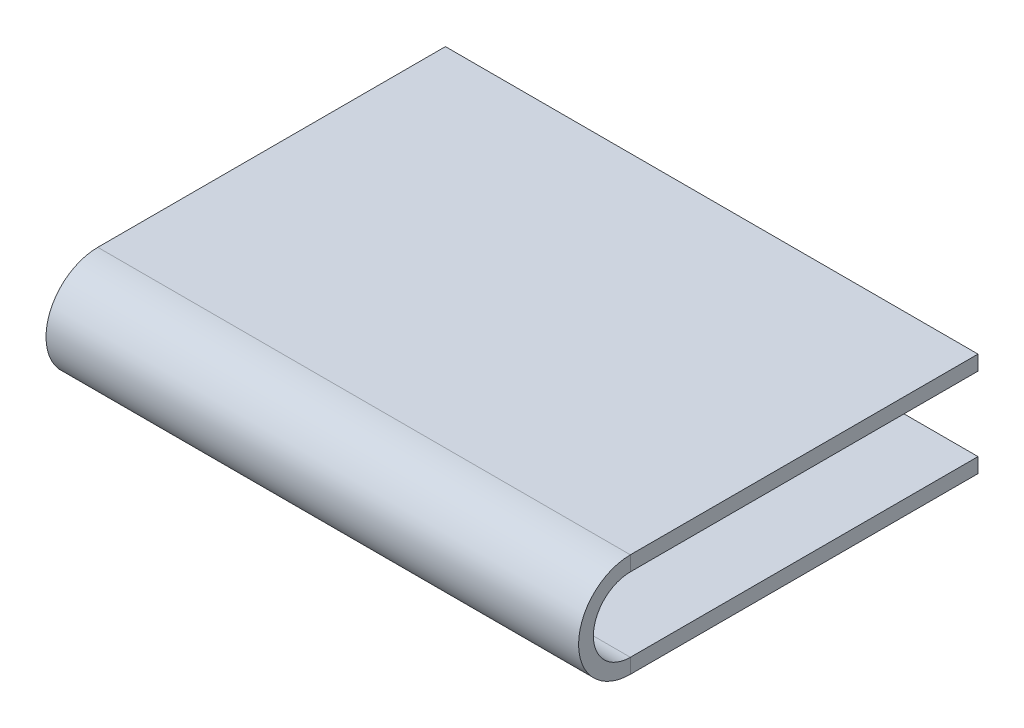
ISO-10303-21;
HEADER;
FILE_DESCRIPTION(('STEP AP214'),'2;1');
FILE_NAME('part.step','',(''),(''),'','','');
FILE_SCHEMA(('AUTOMOTIVE_DESIGN { 1 0 10303 214 1 1 1 1 }'));
ENDSEC;
DATA;
#1=APPLICATION_CONTEXT('core data for automotive mechanical design processes');
#2=APPLICATION_PROTOCOL_DEFINITION('international standard','automotive_design',2000,#1);
#3=PRODUCT_CONTEXT('',#1,'mechanical');
#4=PRODUCT('Part','Part','',(#3));
#5=PRODUCT_RELATED_PRODUCT_CATEGORY('part','',(#4));
#6=PRODUCT_DEFINITION_FORMATION('','',#4);
#7=PRODUCT_DEFINITION_CONTEXT('part definition',#1,'design');
#8=PRODUCT_DEFINITION('design','',#6,#7);
#9=PRODUCT_DEFINITION_SHAPE('','',#8);
#10=(LENGTH_UNIT() NAMED_UNIT(*) SI_UNIT(.MILLI.,.METRE.));
#11=(NAMED_UNIT(*) PLANE_ANGLE_UNIT() SI_UNIT($,.RADIAN.));
#12=(NAMED_UNIT(*) SI_UNIT($,.STERADIAN.) SOLID_ANGLE_UNIT());
#13=UNCERTAINTY_MEASURE_WITH_UNIT(LENGTH_MEASURE(1.E-05),#10,'distance_accuracy_value','');
#14=(GEOMETRIC_REPRESENTATION_CONTEXT(3) GLOBAL_UNCERTAINTY_ASSIGNED_CONTEXT((#13)) GLOBAL_UNIT_ASSIGNED_CONTEXT((#10,
#11,#12)) REPRESENTATION_CONTEXT('',''));
#15=CARTESIAN_POINT('',(0.,0.,0.));
#16=DIRECTION('',(0.,0.,1.));
#17=DIRECTION('',(1.,0.,0.));
#18=AXIS2_PLACEMENT_3D('',#15,#16,#17);
#19=CARTESIAN_POINT('',(36.,0.,23.5));
#20=DIRECTION('',(1.,0.,0.));
#21=DIRECTION('',(0.,0.,-1.));
#22=AXIS2_PLACEMENT_3D('',#19,#20,#21);
#23=PLANE('',#22);
#24=DIRECTION('',(0.,-1.,0.));
#25=VECTOR('',#24,1.);
#26=CARTESIAN_POINT('',(36.,0.,23.5));
#27=LINE('',#26,#25);
#28=CARTESIAN_POINT('',(36.,0.,23.5));
#29=VERTEX_POINT('',#28);
#30=CARTESIAN_POINT('',(36.,-0.999999999999999,23.5));
#31=VERTEX_POINT('',#30);
#32=EDGE_CURVE('E11',#29,#31,#27,.T.);
#33=ORIENTED_EDGE('',*,*,#32,.F.);
#34=CARTESIAN_POINT('',(36.,2.5,23.5));
#35=DIRECTION('',(1.,0.,0.));
#36=DIRECTION('',(0.,0.,-1.));
#37=AXIS2_PLACEMENT_3D('',#34,#35,#36);
#38=CIRCLE('',#37,2.5);
#39=CARTESIAN_POINT('',(36.,4.99999999999999,23.5));
#40=VERTEX_POINT('',#39);
#41=EDGE_CURVE('E136',#40,#29,#38,.T.);
#42=ORIENTED_EDGE('',*,*,#41,.F.);
#43=DIRECTION('',(0.,-1.,0.));
#44=VECTOR('',#43,1.);
#45=CARTESIAN_POINT('',(36.,5.99999999999999,23.5));
#46=LINE('',#45,#44);
#47=CARTESIAN_POINT('',(36.,5.99999999999999,23.5));
#48=VERTEX_POINT('',#47);
#49=EDGE_CURVE('E51',#48,#40,#46,.T.);
#50=ORIENTED_EDGE('',*,*,#49,.F.);
#51=CARTESIAN_POINT('',(36.,2.5,23.5));
#52=DIRECTION('',(1.,0.,0.));
#53=DIRECTION('',(0.,1.,0.));
#54=AXIS2_PLACEMENT_3D('',#51,#52,#53);
#55=CIRCLE('',#54,3.5);
#56=EDGE_CURVE('E132',#48,#31,#55,.T.);
#57=ORIENTED_EDGE('',*,*,#56,.T.);
#58=EDGE_LOOP('',(#33,#42,#50,#57));
#59=FACE_BOUND('',#58,.T.);
#60=ADVANCED_FACE('F43',(#59),#23,.T.);
#61=CARTESIAN_POINT('',(36.,5.99999999999999,23.5));
#62=DIRECTION('',(1.,0.,0.));
#63=DIRECTION('',(0.,0.,-1.));
#64=AXIS2_PLACEMENT_3D('',#61,#62,#63);
#65=PLANE('',#64);
#66=DIRECTION('',(0.,0.,-1.));
#67=VECTOR('',#66,1.);
#68=CARTESIAN_POINT('',(36.,0.,0.));
#69=LINE('',#68,#67);
#70=CARTESIAN_POINT('',(36.,0.,0.));
#71=VERTEX_POINT('',#70);
#72=EDGE_CURVE('E190',#29,#71,#69,.T.);
#73=ORIENTED_EDGE('',*,*,#72,.F.);
#74=ORIENTED_EDGE('',*,*,#32,.T.);
#75=DIRECTION('',(0.,0.,-1.));
#76=VECTOR('',#75,1.);
#77=CARTESIAN_POINT('',(36.,-1.,0.));
#78=LINE('',#77,#76);
#79=CARTESIAN_POINT('',(36.,-1.,0.));
#80=VERTEX_POINT('',#79);
#81=EDGE_CURVE('E97',#31,#80,#78,.T.);
#82=ORIENTED_EDGE('',*,*,#81,.T.);
#83=DIRECTION('',(0.,-1.,0.));
#84=VECTOR('',#83,1.);
#85=CARTESIAN_POINT('',(36.,0.,0.));
#86=LINE('',#85,#84);
#87=EDGE_CURVE('E347',#71,#80,#86,.T.);
#88=ORIENTED_EDGE('',*,*,#87,.F.);
#89=EDGE_LOOP('',(#73,#74,#82,#88));
#90=FACE_BOUND('',#89,.T.);
#91=ADVANCED_FACE('F197',(#90),#65,.T.);
#92=CARTESIAN_POINT('',(0.,4.99999999999999,23.5));
#93=DIRECTION('',(-1.,0.,0.));
#94=DIRECTION('',(0.,0.,1.));
#95=AXIS2_PLACEMENT_3D('',#92,#93,#94);
#96=PLANE('',#95);
#97=DIRECTION('',(0.,1.,0.));
#98=VECTOR('',#97,1.);
#99=CARTESIAN_POINT('',(0.,4.99999999999999,23.5));
#100=LINE('',#99,#98);
#101=CARTESIAN_POINT('',(0.,4.99999999999999,23.5));
#102=VERTEX_POINT('',#101);
#103=CARTESIAN_POINT('',(0.,5.99999999999999,23.5));
#104=VERTEX_POINT('',#103);
#105=EDGE_CURVE('E88',#102,#104,#100,.T.);
#106=ORIENTED_EDGE('',*,*,#105,.F.);
#107=CARTESIAN_POINT('',(0.,2.5,23.5));
#108=DIRECTION('',(1.,0.,0.));
#109=DIRECTION('',(0.,0.,-1.));
#110=AXIS2_PLACEMENT_3D('',#107,#108,#109);
#111=CIRCLE('',#110,2.5);
#112=CARTESIAN_POINT('',(0.,0.,23.5));
#113=VERTEX_POINT('',#112);
#114=EDGE_CURVE('E154',#102,#113,#111,.T.);
#115=ORIENTED_EDGE('',*,*,#114,.T.);
#116=DIRECTION('',(0.,1.,0.));
#117=VECTOR('',#116,1.);
#118=CARTESIAN_POINT('',(0.,-0.999999999999999,23.5));
#119=LINE('',#118,#117);
#120=CARTESIAN_POINT('',(0.,-0.999999999999999,23.5));
#121=VERTEX_POINT('',#120);
#122=EDGE_CURVE('E91',#121,#113,#119,.T.);
#123=ORIENTED_EDGE('',*,*,#122,.F.);
#124=CARTESIAN_POINT('',(0.,2.5,23.5));
#125=DIRECTION('',(1.,0.,0.));
#126=DIRECTION('',(0.,1.,0.));
#127=AXIS2_PLACEMENT_3D('',#124,#125,#126);
#128=CIRCLE('',#127,3.5);
#129=EDGE_CURVE('E165',#104,#121,#128,.T.);
#130=ORIENTED_EDGE('',*,*,#129,.F.);
#131=EDGE_LOOP('',(#106,#115,#123,#130));
#132=FACE_BOUND('',#131,.T.);
#133=ADVANCED_FACE('F191',(#132),#96,.T.);
#134=CARTESIAN_POINT('',(0.,-0.999999999999999,23.5));
#135=DIRECTION('',(-1.,0.,0.));
#136=DIRECTION('',(0.,0.,1.));
#137=AXIS2_PLACEMENT_3D('',#134,#135,#136);
#138=PLANE('',#137);
#139=DIRECTION('',(0.,0.,1.));
#140=VECTOR('',#139,1.);
#141=CARTESIAN_POINT('',(0.,5.,0.));
#142=LINE('',#141,#140);
#143=CARTESIAN_POINT('',(0.,5.,0.));
#144=VERTEX_POINT('',#143);
#145=EDGE_CURVE('E160',#144,#102,#142,.T.);
#146=ORIENTED_EDGE('',*,*,#145,.T.);
#147=ORIENTED_EDGE('',*,*,#105,.T.);
#148=DIRECTION('',(0.,0.,1.));
#149=VECTOR('',#148,1.);
#150=CARTESIAN_POINT('',(0.,6.,0.));
#151=LINE('',#150,#149);
#152=CARTESIAN_POINT('',(0.,6.,0.));
#153=VERTEX_POINT('',#152);
#154=EDGE_CURVE('E159',#153,#104,#151,.T.);
#155=ORIENTED_EDGE('',*,*,#154,.F.);
#156=DIRECTION('',(0.,-1.,0.));
#157=VECTOR('',#156,1.);
#158=CARTESIAN_POINT('',(0.,6.,0.));
#159=LINE('',#158,#157);
#160=EDGE_CURVE('E121',#153,#144,#159,.T.);
#161=ORIENTED_EDGE('',*,*,#160,.T.);
#162=EDGE_LOOP('',(#146,#147,#155,#161));
#163=FACE_BOUND('',#162,.T.);
#164=ADVANCED_FACE('F193',(#163),#138,.T.);
#165=CARTESIAN_POINT('',(36.,-1.,0.));
#166=DIRECTION('',(0.,1.,0.));
#167=DIRECTION('',(0.,0.,1.));
#168=AXIS2_PLACEMENT_3D('',#165,#166,#167);
#169=PLANE('',#168);
#170=DIRECTION('',(0.,0.,-1.));
#171=VECTOR('',#170,1.);
#172=CARTESIAN_POINT('',(0.,-1.,0.));
#173=LINE('',#172,#171);
#174=CARTESIAN_POINT('',(0.,-1.,0.));
#175=VERTEX_POINT('',#174);
#176=EDGE_CURVE('E148',#121,#175,#173,.T.);
#177=ORIENTED_EDGE('',*,*,#176,.T.);
#178=DIRECTION('',(-1.,0.,0.));
#179=VECTOR('',#178,1.);
#180=CARTESIAN_POINT('',(36.,-1.,0.));
#181=LINE('',#180,#179);
#182=EDGE_CURVE('E176',#80,#175,#181,.T.);
#183=ORIENTED_EDGE('',*,*,#182,.F.);
#184=ORIENTED_EDGE('',*,*,#81,.F.);
#185=DIRECTION('',(-1.,0.,0.));
#186=VECTOR('',#185,1.);
#187=CARTESIAN_POINT('',(36.,-0.999999999999999,23.5));
#188=LINE('',#187,#186);
#189=EDGE_CURVE('E144',#31,#121,#188,.T.);
#190=ORIENTED_EDGE('',*,*,#189,.T.);
#191=EDGE_LOOP('',(#177,#183,#184,#190));
#192=FACE_BOUND('',#191,.T.);
#193=ADVANCED_FACE('F201',(#192),#169,.F.);
#194=CARTESIAN_POINT('',(36.,0.,0.));
#195=DIRECTION('',(0.,0.,-1.));
#196=DIRECTION('',(0.,1.,0.));
#197=AXIS2_PLACEMENT_3D('',#194,#195,#196);
#198=PLANE('',#197);
#199=DIRECTION('',(0.,-1.,0.));
#200=VECTOR('',#199,1.);
#201=CARTESIAN_POINT('',(0.,0.,0.));
#202=LINE('',#201,#200);
#203=CARTESIAN_POINT('',(0.,0.,0.));
#204=VERTEX_POINT('',#203);
#205=EDGE_CURVE('E149',#204,#175,#202,.T.);
#206=ORIENTED_EDGE('',*,*,#205,.F.);
#207=DIRECTION('',(-1.,0.,0.));
#208=VECTOR('',#207,1.);
#209=CARTESIAN_POINT('',(36.,0.,0.));
#210=LINE('',#209,#208);
#211=EDGE_CURVE('E173',#71,#204,#210,.T.);
#212=ORIENTED_EDGE('',*,*,#211,.F.);
#213=ORIENTED_EDGE('',*,*,#87,.T.);
#214=ORIENTED_EDGE('',*,*,#182,.T.);
#215=EDGE_LOOP('',(#206,#212,#213,#214));
#216=FACE_BOUND('',#215,.T.);
#217=ADVANCED_FACE('F237',(#216),#198,.T.);
#218=CARTESIAN_POINT('',(36.,0.,0.));
#219=DIRECTION('',(0.,1.,0.));
#220=DIRECTION('',(0.,0.,1.));
#221=AXIS2_PLACEMENT_3D('',#218,#219,#220);
#222=PLANE('',#221);
#223=DIRECTION('',(0.,0.,-1.));
#224=VECTOR('',#223,1.);
#225=CARTESIAN_POINT('',(0.,0.,0.));
#226=LINE('',#225,#224);
#227=EDGE_CURVE('E155',#113,#204,#226,.T.);
#228=ORIENTED_EDGE('',*,*,#227,.F.);
#229=DIRECTION('',(-1.,0.,0.));
#230=VECTOR('',#229,1.);
#231=CARTESIAN_POINT('',(36.,0.,23.5));
#232=LINE('',#231,#230);
#233=EDGE_CURVE('E171',#29,#113,#232,.T.);
#234=ORIENTED_EDGE('',*,*,#233,.F.);
#235=ORIENTED_EDGE('',*,*,#72,.T.);
#236=ORIENTED_EDGE('',*,*,#211,.T.);
#237=EDGE_LOOP('',(#228,#234,#235,#236));
#238=FACE_BOUND('',#237,.T.);
#239=ADVANCED_FACE('F249',(#238),#222,.T.);
#240=CARTESIAN_POINT('',(36.,2.5,23.5));
#241=DIRECTION('',(-1.,0.,0.));
#242=DIRECTION('',(0.,0.,1.));
#243=AXIS2_PLACEMENT_3D('',#240,#241,#242);
#244=CYLINDRICAL_SURFACE('',#243,2.5);
#245=ORIENTED_EDGE('',*,*,#114,.F.);
#246=DIRECTION('',(-1.,0.,0.));
#247=VECTOR('',#246,1.);
#248=CARTESIAN_POINT('',(36.,4.99999999999999,23.5));
#249=LINE('',#248,#247);
#250=EDGE_CURVE('E169',#40,#102,#249,.T.);
#251=ORIENTED_EDGE('',*,*,#250,.F.);
#252=ORIENTED_EDGE('',*,*,#41,.T.);
#253=ORIENTED_EDGE('',*,*,#233,.T.);
#254=EDGE_LOOP('',(#245,#251,#252,#253));
#255=FACE_BOUND('',#254,.T.);
#256=ADVANCED_FACE('F183',(#255),#244,.F.);
#257=CARTESIAN_POINT('',(36.,5.,0.));
#258=DIRECTION('',(0.,-1.,0.));
#259=DIRECTION('',(0.,0.,-1.));
#260=AXIS2_PLACEMENT_3D('',#257,#258,#259);
#261=PLANE('',#260);
#262=ORIENTED_EDGE('',*,*,#145,.F.);
#263=DIRECTION('',(-1.,0.,0.));
#264=VECTOR('',#263,1.);
#265=CARTESIAN_POINT('',(36.,5.,0.));
#266=LINE('',#265,#264);
#267=CARTESIAN_POINT('',(36.,5.,0.));
#268=VERTEX_POINT('',#267);
#269=EDGE_CURVE('E122',#268,#144,#266,.T.);
#270=ORIENTED_EDGE('',*,*,#269,.F.);
#271=DIRECTION('',(0.,0.,1.));
#272=VECTOR('',#271,1.);
#273=CARTESIAN_POINT('',(36.,5.,0.));
#274=LINE('',#273,#272);
#275=EDGE_CURVE('E137',#268,#40,#274,.T.);
#276=ORIENTED_EDGE('',*,*,#275,.T.);
#277=ORIENTED_EDGE('',*,*,#250,.T.);
#278=EDGE_LOOP('',(#262,#270,#276,#277));
#279=FACE_BOUND('',#278,.T.);
#280=ADVANCED_FACE('F186',(#279),#261,.T.);
#281=CARTESIAN_POINT('',(36.,6.,0.));
#282=DIRECTION('',(0.,0.,-1.));
#283=DIRECTION('',(0.,1.,0.));
#284=AXIS2_PLACEMENT_3D('',#281,#282,#283);
#285=PLANE('',#284);
#286=ORIENTED_EDGE('',*,*,#160,.F.);
#287=DIRECTION('',(-1.,0.,0.));
#288=VECTOR('',#287,1.);
#289=CARTESIAN_POINT('',(36.,6.,0.));
#290=LINE('',#289,#288);
#291=CARTESIAN_POINT('',(36.,6.,0.));
#292=VERTEX_POINT('',#291);
#293=EDGE_CURVE('E113',#292,#153,#290,.T.);
#294=ORIENTED_EDGE('',*,*,#293,.F.);
#295=DIRECTION('',(0.,-1.,0.));
#296=VECTOR('',#295,1.);
#297=CARTESIAN_POINT('',(36.,6.,0.));
#298=LINE('',#297,#296);
#299=EDGE_CURVE('E118',#292,#268,#298,.T.);
#300=ORIENTED_EDGE('',*,*,#299,.T.);
#301=ORIENTED_EDGE('',*,*,#269,.T.);
#302=EDGE_LOOP('',(#286,#294,#300,#301));
#303=FACE_BOUND('',#302,.T.);
#304=ADVANCED_FACE('F117',(#303),#285,.T.);
#305=CARTESIAN_POINT('',(36.,6.,0.));
#306=DIRECTION('',(0.,-1.,0.));
#307=DIRECTION('',(0.,0.,-1.));
#308=AXIS2_PLACEMENT_3D('',#305,#306,#307);
#309=PLANE('',#308);
#310=ORIENTED_EDGE('',*,*,#154,.T.);
#311=DIRECTION('',(-1.,0.,0.));
#312=VECTOR('',#311,1.);
#313=CARTESIAN_POINT('',(36.,5.99999999999999,23.5));
#314=LINE('',#313,#312);
#315=EDGE_CURVE('E123',#48,#104,#314,.T.);
#316=ORIENTED_EDGE('',*,*,#315,.F.);
#317=DIRECTION('',(0.,0.,1.));
#318=VECTOR('',#317,1.);
#319=CARTESIAN_POINT('',(36.,6.,0.));
#320=LINE('',#319,#318);
#321=EDGE_CURVE('E126',#292,#48,#320,.T.);
#322=ORIENTED_EDGE('',*,*,#321,.F.);
#323=ORIENTED_EDGE('',*,*,#293,.T.);
#324=EDGE_LOOP('',(#310,#316,#322,#323));
#325=FACE_BOUND('',#324,.T.);
#326=ADVANCED_FACE('F129',(#325),#309,.F.);
#327=CARTESIAN_POINT('',(36.,2.5,23.5));
#328=DIRECTION('',(-1.,0.,0.));
#329=DIRECTION('',(0.,0.,1.));
#330=AXIS2_PLACEMENT_3D('',#327,#328,#329);
#331=CYLINDRICAL_SURFACE('',#330,3.5);
#332=ORIENTED_EDGE('',*,*,#129,.T.);
#333=ORIENTED_EDGE('',*,*,#189,.F.);
#334=ORIENTED_EDGE('',*,*,#56,.F.);
#335=ORIENTED_EDGE('',*,*,#315,.T.);
#336=EDGE_LOOP('',(#332,#333,#334,#335));
#337=FACE_BOUND('',#336,.T.);
#338=ADVANCED_FACE('F192',(#337),#331,.T.);
#339=CARTESIAN_POINT('',(36.,2.5,23.5));
#340=DIRECTION('',(1.,0.,0.));
#341=DIRECTION('',(0.,1.,0.));
#342=AXIS2_PLACEMENT_3D('',#339,#340,#341);
#343=PLANE('',#342);
#344=ORIENTED_EDGE('',*,*,#321,.T.);
#345=ORIENTED_EDGE('',*,*,#49,.T.);
#346=ORIENTED_EDGE('',*,*,#275,.F.);
#347=ORIENTED_EDGE('',*,*,#299,.F.);
#348=EDGE_LOOP('',(#344,#345,#346,#347));
#349=FACE_BOUND('',#348,.T.);
#350=ADVANCED_FACE('F138',(#349),#343,.T.);
#351=CARTESIAN_POINT('',(0.,2.5,23.5));
#352=DIRECTION('',(1.,0.,0.));
#353=DIRECTION('',(0.,1.,0.));
#354=AXIS2_PLACEMENT_3D('',#351,#352,#353);
#355=PLANE('',#354);
#356=ORIENTED_EDGE('',*,*,#176,.F.);
#357=ORIENTED_EDGE('',*,*,#122,.T.);
#358=ORIENTED_EDGE('',*,*,#227,.T.);
#359=ORIENTED_EDGE('',*,*,#205,.T.);
#360=EDGE_LOOP('',(#356,#357,#358,#359));
#361=FACE_BOUND('',#360,.T.);
#362=ADVANCED_FACE('F311',(#361),#355,.F.);
#363=CLOSED_SHELL('',(#60,#91,#133,#164,#193,#217,#239,#256,#280,#304,#326,#338,#350,#362));
#364=MANIFOLD_SOLID_BREP('B2',#363);
#365=ADVANCED_BREP_SHAPE_REPRESENTATION('',(#18,#364),#14);
#366=SHAPE_DEFINITION_REPRESENTATION(#9,#365);
ENDSEC;
END-ISO-10303-21;
